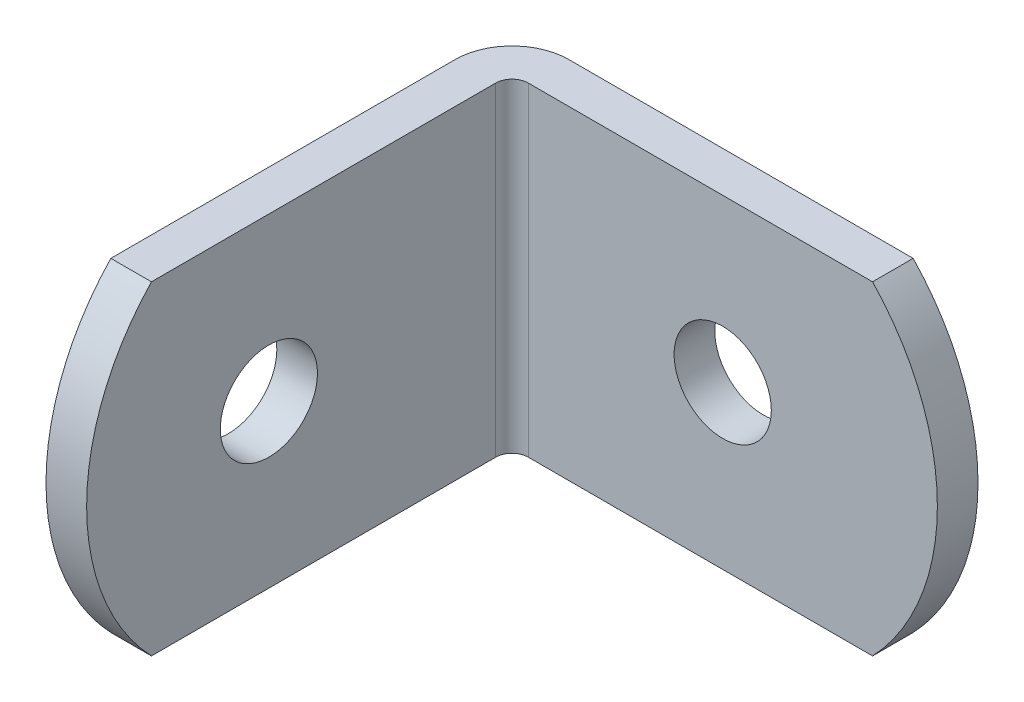
ISO-10303-21;
HEADER;
FILE_DESCRIPTION(('STEP AP214'),'2;1');
FILE_NAME('part.step','',(''),(''),'','','');
FILE_SCHEMA(('AUTOMOTIVE_DESIGN { 1 0 10303 214 1 1 1 1 }'));
ENDSEC;
DATA;
#1=APPLICATION_CONTEXT('core data for automotive mechanical design processes');
#2=APPLICATION_PROTOCOL_DEFINITION('international standard','automotive_design',2000,#1);
#3=PRODUCT_CONTEXT('',#1,'mechanical');
#4=PRODUCT('Part','Part','',(#3));
#5=PRODUCT_RELATED_PRODUCT_CATEGORY('part','',(#4));
#6=PRODUCT_DEFINITION_FORMATION('','',#4);
#7=PRODUCT_DEFINITION_CONTEXT('part definition',#1,'design');
#8=PRODUCT_DEFINITION('design','',#6,#7);
#9=PRODUCT_DEFINITION_SHAPE('','',#8);
#10=(LENGTH_UNIT() NAMED_UNIT(*) SI_UNIT(.MILLI.,.METRE.));
#11=(NAMED_UNIT(*) PLANE_ANGLE_UNIT() SI_UNIT($,.RADIAN.));
#12=(NAMED_UNIT(*) SI_UNIT($,.STERADIAN.) SOLID_ANGLE_UNIT());
#13=UNCERTAINTY_MEASURE_WITH_UNIT(LENGTH_MEASURE(1.E-05),#10,'distance_accuracy_value','');
#14=(GEOMETRIC_REPRESENTATION_CONTEXT(3) GLOBAL_UNCERTAINTY_ASSIGNED_CONTEXT((#13)) GLOBAL_UNIT_ASSIGNED_CONTEXT((#10,
#11,#12)) REPRESENTATION_CONTEXT('',''));
#15=CARTESIAN_POINT('',(0.,0.,0.));
#16=DIRECTION('',(0.,0.,1.));
#17=DIRECTION('',(1.,0.,0.));
#18=AXIS2_PLACEMENT_3D('',#15,#16,#17);
#19=CARTESIAN_POINT('',(73.5960459180228,0.,11.41095));
#20=DIRECTION('',(-1.,0.,0.));
#21=DIRECTION('',(0.,0.,1.));
#22=AXIS2_PLACEMENT_3D('',#19,#20,#21);
#23=CYLINDRICAL_SURFACE('',#22,11.60145);
#24=DIRECTION('',(-1.,0.,0.));
#25=VECTOR('',#24,1.);
#26=CARTESIAN_POINT('',(73.5960459180228,-8.001,19.812));
#27=LINE('',#26,#25);
#28=CARTESIAN_POINT('',(0.,-8.001,19.812));
#29=VERTEX_POINT('',#28);
#30=CARTESIAN_POINT('',(2.0066,-8.001,19.812));
#31=VERTEX_POINT('',#30);
#32=EDGE_CURVE('E42',#29,#31,#27,.F.);
#33=ORIENTED_EDGE('',*,*,#32,.T.);
#34=CARTESIAN_POINT('',(2.0066,0.,11.41095));
#35=DIRECTION('',(-1.,0.,0.));
#36=DIRECTION('',(0.,0.,1.));
#37=AXIS2_PLACEMENT_3D('',#34,#35,#36);
#38=CIRCLE('',#37,11.60145);
#39=CARTESIAN_POINT('',(2.0066,8.001,19.812));
#40=VERTEX_POINT('',#39);
#41=EDGE_CURVE('E129',#40,#31,#38,.F.);
#42=ORIENTED_EDGE('',*,*,#41,.F.);
#43=DIRECTION('',(-1.,0.,0.));
#44=VECTOR('',#43,1.);
#45=CARTESIAN_POINT('',(73.5960459180228,8.001,19.812));
#46=LINE('',#45,#44);
#47=CARTESIAN_POINT('',(0.,8.001,19.812));
#48=VERTEX_POINT('',#47);
#49=EDGE_CURVE('E125',#40,#48,#46,.T.);
#50=ORIENTED_EDGE('',*,*,#49,.T.);
#51=CARTESIAN_POINT('',(0.,0.,11.41095));
#52=DIRECTION('',(-1.,0.,0.));
#53=DIRECTION('',(0.,0.,1.));
#54=AXIS2_PLACEMENT_3D('',#51,#52,#53);
#55=CIRCLE('',#54,11.60145);
#56=EDGE_CURVE('E131',#48,#29,#55,.F.);
#57=ORIENTED_EDGE('',*,*,#56,.T.);
#58=EDGE_LOOP('',(#33,#42,#50,#57));
#59=FACE_BOUND('',#58,.T.);
#60=ADVANCED_FACE('F34',(#59),#23,.T.);
#61=CARTESIAN_POINT('',(2.80924,8.001,2.0066));
#62=DIRECTION('',(0.,0.,-1.));
#63=DIRECTION('',(-1.,0.,0.));
#64=AXIS2_PLACEMENT_3D('',#61,#62,#63);
#65=PLANE('',#64);
#66=CARTESIAN_POINT('',(12.4124,0.,2.0066));
#67=DIRECTION('',(0.,0.,1.));
#68=DIRECTION('',(1.,0.,0.));
#69=AXIS2_PLACEMENT_3D('',#66,#67,#68);
#70=CIRCLE('',#69,2.4);
#71=CARTESIAN_POINT('',(14.8124,0.,2.0066));
#72=VERTEX_POINT('',#71);
#73=EDGE_CURVE('E181',#72,#72,#70,.T.);
#74=ORIENTED_EDGE('',*,*,#73,.F.);
#75=EDGE_LOOP('',(#74));
#76=FACE_BOUND('',#75,.T.);
#77=DIRECTION('',(1.,0.,0.));
#78=VECTOR('',#77,1.);
#79=CARTESIAN_POINT('',(2.80924,-8.001,2.0066));
#80=LINE('',#79,#78);
#81=CARTESIAN_POINT('',(2.80924,-8.001,2.0066));
#82=VERTEX_POINT('',#81);
#83=CARTESIAN_POINT('',(19.812,-8.001,2.0066));
#84=VERTEX_POINT('',#83);
#85=EDGE_CURVE('E108',#82,#84,#80,.T.);
#86=ORIENTED_EDGE('',*,*,#85,.T.);
#87=CARTESIAN_POINT('',(11.41095,0.,2.0066));
#88=DIRECTION('',(0.,0.,-1.));
#89=DIRECTION('',(-1.,0.,0.));
#90=AXIS2_PLACEMENT_3D('',#87,#88,#89);
#91=CIRCLE('',#90,11.60145);
#92=CARTESIAN_POINT('',(19.812,8.001,2.0066));
#93=VERTEX_POINT('',#92);
#94=EDGE_CURVE('E56',#84,#93,#91,.F.);
#95=ORIENTED_EDGE('',*,*,#94,.T.);
#96=DIRECTION('',(1.,0.,0.));
#97=VECTOR('',#96,1.);
#98=CARTESIAN_POINT('',(2.80924,8.001,2.0066));
#99=LINE('',#98,#97);
#100=CARTESIAN_POINT('',(2.80924,8.001,2.0066));
#101=VERTEX_POINT('',#100);
#102=EDGE_CURVE('E134',#101,#93,#99,.T.);
#103=ORIENTED_EDGE('',*,*,#102,.F.);
#104=DIRECTION('',(0.,-1.,0.));
#105=VECTOR('',#104,1.);
#106=CARTESIAN_POINT('',(2.80924,8.001,2.0066));
#107=LINE('',#106,#105);
#108=EDGE_CURVE('E147',#101,#82,#107,.T.);
#109=ORIENTED_EDGE('',*,*,#108,.T.);
#110=EDGE_LOOP('',(#86,#95,#103,#109));
#111=FACE_BOUND('',#110,.T.);
#112=ADVANCED_FACE('F36',(#76,#111),#65,.F.);
#113=CARTESIAN_POINT('',(2.80924,8.001,0.));
#114=DIRECTION('',(0.,0.,-1.));
#115=DIRECTION('',(-1.,0.,0.));
#116=AXIS2_PLACEMENT_3D('',#113,#114,#115);
#117=PLANE('',#116);
#118=CARTESIAN_POINT('',(12.4124,0.,0.));
#119=DIRECTION('',(0.,0.,1.));
#120=DIRECTION('',(1.,0.,0.));
#121=AXIS2_PLACEMENT_3D('',#118,#119,#120);
#122=CIRCLE('',#121,2.4);
#123=CARTESIAN_POINT('',(14.8124,0.,0.));
#124=VERTEX_POINT('',#123);
#125=EDGE_CURVE('E179',#124,#124,#122,.T.);
#126=ORIENTED_EDGE('',*,*,#125,.T.);
#127=EDGE_LOOP('',(#126));
#128=FACE_BOUND('',#127,.T.);
#129=CARTESIAN_POINT('',(11.41095,0.,0.));
#130=DIRECTION('',(0.,0.,-1.));
#131=DIRECTION('',(-1.,0.,0.));
#132=AXIS2_PLACEMENT_3D('',#129,#130,#131);
#133=CIRCLE('',#132,11.60145);
#134=CARTESIAN_POINT('',(19.812,-8.001,0.));
#135=VERTEX_POINT('',#134);
#136=CARTESIAN_POINT('',(19.812,8.001,0.));
#137=VERTEX_POINT('',#136);
#138=EDGE_CURVE('E48',#135,#137,#133,.F.);
#139=ORIENTED_EDGE('',*,*,#138,.F.);
#140=DIRECTION('',(1.,0.,0.));
#141=VECTOR('',#140,1.);
#142=CARTESIAN_POINT('',(2.80924,-8.001,0.));
#143=LINE('',#142,#141);
#144=CARTESIAN_POINT('',(2.80924,-8.001,0.));
#145=VERTEX_POINT('',#144);
#146=EDGE_CURVE('E102',#145,#135,#143,.T.);
#147=ORIENTED_EDGE('',*,*,#146,.F.);
#148=DIRECTION('',(0.,-1.,0.));
#149=VECTOR('',#148,1.);
#150=CARTESIAN_POINT('',(2.80924,8.001,0.));
#151=LINE('',#150,#149);
#152=CARTESIAN_POINT('',(2.80924,8.001,0.));
#153=VERTEX_POINT('',#152);
#154=EDGE_CURVE('E163',#153,#145,#151,.T.);
#155=ORIENTED_EDGE('',*,*,#154,.F.);
#156=DIRECTION('',(1.,0.,0.));
#157=VECTOR('',#156,1.);
#158=CARTESIAN_POINT('',(2.80924,8.001,0.));
#159=LINE('',#158,#157);
#160=EDGE_CURVE('E113',#153,#137,#159,.T.);
#161=ORIENTED_EDGE('',*,*,#160,.T.);
#162=EDGE_LOOP('',(#139,#147,#155,#161));
#163=FACE_BOUND('',#162,.T.);
#164=ADVANCED_FACE('F111',(#128,#163),#117,.T.);
#165=CARTESIAN_POINT('',(2.80924,8.001,2.80924));
#166=DIRECTION('',(0.,-1.,0.));
#167=DIRECTION('',(0.,0.,-1.));
#168=AXIS2_PLACEMENT_3D('',#165,#166,#167);
#169=CYLINDRICAL_SURFACE('',#168,2.80924);
#170=CARTESIAN_POINT('',(2.80924,-8.001,2.80924));
#171=DIRECTION('',(0.,-1.,0.));
#172=DIRECTION('',(0.,0.,1.));
#173=AXIS2_PLACEMENT_3D('',#170,#171,#172);
#174=CIRCLE('',#173,2.80924);
#175=CARTESIAN_POINT('',(0.,-8.001,2.80924));
#176=VERTEX_POINT('',#175);
#177=EDGE_CURVE('E106',#176,#145,#174,.T.);
#178=ORIENTED_EDGE('',*,*,#177,.F.);
#179=DIRECTION('',(0.,-1.,0.));
#180=VECTOR('',#179,1.);
#181=CARTESIAN_POINT('',(0.,8.001,2.80924));
#182=LINE('',#181,#180);
#183=CARTESIAN_POINT('',(0.,8.001,2.80924));
#184=VERTEX_POINT('',#183);
#185=EDGE_CURVE('E160',#184,#176,#182,.T.);
#186=ORIENTED_EDGE('',*,*,#185,.F.);
#187=CARTESIAN_POINT('',(2.80924,8.001,2.80924));
#188=DIRECTION('',(0.,-1.,0.));
#189=DIRECTION('',(0.,0.,1.));
#190=AXIS2_PLACEMENT_3D('',#187,#188,#189);
#191=CIRCLE('',#190,2.80924);
#192=EDGE_CURVE('E138',#184,#153,#191,.T.);
#193=ORIENTED_EDGE('',*,*,#192,.T.);
#194=ORIENTED_EDGE('',*,*,#154,.T.);
#195=EDGE_LOOP('',(#178,#186,#193,#194));
#196=FACE_BOUND('',#195,.T.);
#197=ADVANCED_FACE('F176',(#196),#169,.T.);
#198=CARTESIAN_POINT('',(0.,8.001,2.80924));
#199=DIRECTION('',(-1.,0.,0.));
#200=DIRECTION('',(0.,0.,1.));
#201=AXIS2_PLACEMENT_3D('',#198,#199,#200);
#202=PLANE('',#201);
#203=CARTESIAN_POINT('',(0.,0.,14.0124));
#204=DIRECTION('',(1.,0.,0.));
#205=DIRECTION('',(0.,0.,-1.));
#206=AXIS2_PLACEMENT_3D('',#203,#204,#205);
#207=CIRCLE('',#206,2.4);
#208=CARTESIAN_POINT('',(0.,0.,11.6124));
#209=VERTEX_POINT('',#208);
#210=EDGE_CURVE('E120',#209,#209,#207,.T.);
#211=ORIENTED_EDGE('',*,*,#210,.T.);
#212=EDGE_LOOP('',(#211));
#213=FACE_BOUND('',#212,.T.);
#214=ORIENTED_EDGE('',*,*,#56,.F.);
#215=DIRECTION('',(0.,0.,-1.));
#216=VECTOR('',#215,1.);
#217=CARTESIAN_POINT('',(0.,8.001,2.80924));
#218=LINE('',#217,#216);
#219=EDGE_CURVE('E141',#48,#184,#218,.T.);
#220=ORIENTED_EDGE('',*,*,#219,.T.);
#221=ORIENTED_EDGE('',*,*,#185,.T.);
#222=DIRECTION('',(0.,0.,-1.));
#223=VECTOR('',#222,1.);
#224=CARTESIAN_POINT('',(0.,-8.001,2.80924));
#225=LINE('',#224,#223);
#226=EDGE_CURVE('E150',#29,#176,#225,.T.);
#227=ORIENTED_EDGE('',*,*,#226,.F.);
#228=EDGE_LOOP('',(#214,#220,#221,#227));
#229=FACE_BOUND('',#228,.T.);
#230=ADVANCED_FACE('F171',(#213,#229),#202,.T.);
#231=CARTESIAN_POINT('',(2.0066,8.001,2.80924));
#232=DIRECTION('',(-1.,0.,0.));
#233=DIRECTION('',(0.,0.,1.));
#234=AXIS2_PLACEMENT_3D('',#231,#232,#233);
#235=PLANE('',#234);
#236=CARTESIAN_POINT('',(2.0066,0.,14.0124));
#237=DIRECTION('',(1.,0.,0.));
#238=DIRECTION('',(0.,0.,-1.));
#239=AXIS2_PLACEMENT_3D('',#236,#237,#238);
#240=CIRCLE('',#239,2.4);
#241=CARTESIAN_POINT('',(2.0066,0.,11.6124));
#242=VERTEX_POINT('',#241);
#243=EDGE_CURVE('E117',#242,#242,#240,.T.);
#244=ORIENTED_EDGE('',*,*,#243,.F.);
#245=EDGE_LOOP('',(#244));
#246=FACE_BOUND('',#245,.T.);
#247=ORIENTED_EDGE('',*,*,#41,.T.);
#248=DIRECTION('',(0.,0.,-1.));
#249=VECTOR('',#248,1.);
#250=CARTESIAN_POINT('',(2.0066,-8.001,2.80924));
#251=LINE('',#250,#249);
#252=CARTESIAN_POINT('',(2.0066,-8.001,2.80924));
#253=VERTEX_POINT('',#252);
#254=EDGE_CURVE('E152',#31,#253,#251,.T.);
#255=ORIENTED_EDGE('',*,*,#254,.T.);
#256=DIRECTION('',(0.,-1.,0.));
#257=VECTOR('',#256,1.);
#258=CARTESIAN_POINT('',(2.0066,8.001,2.80924));
#259=LINE('',#258,#257);
#260=CARTESIAN_POINT('',(2.0066,8.001,2.80924));
#261=VERTEX_POINT('',#260);
#262=EDGE_CURVE('E157',#261,#253,#259,.T.);
#263=ORIENTED_EDGE('',*,*,#262,.F.);
#264=DIRECTION('',(0.,0.,-1.));
#265=VECTOR('',#264,1.);
#266=CARTESIAN_POINT('',(2.0066,8.001,2.80924));
#267=LINE('',#266,#265);
#268=EDGE_CURVE('E143',#40,#261,#267,.T.);
#269=ORIENTED_EDGE('',*,*,#268,.F.);
#270=EDGE_LOOP('',(#247,#255,#263,#269));
#271=FACE_BOUND('',#270,.T.);
#272=ADVANCED_FACE('F197',(#246,#271),#235,.F.);
#273=CARTESIAN_POINT('',(2.80924,8.001,2.80924));
#274=DIRECTION('',(0.,-1.,0.));
#275=DIRECTION('',(0.,0.,-1.));
#276=AXIS2_PLACEMENT_3D('',#273,#274,#275);
#277=CYLINDRICAL_SURFACE('',#276,0.80264);
#278=CARTESIAN_POINT('',(2.80924,-8.001,2.80924));
#279=DIRECTION('',(0.,1.,0.));
#280=DIRECTION('',(1.,0.,0.));
#281=AXIS2_PLACEMENT_3D('',#278,#279,#280);
#282=CIRCLE('',#281,0.80264);
#283=EDGE_CURVE('E136',#253,#82,#282,.F.);
#284=ORIENTED_EDGE('',*,*,#283,.T.);
#285=ORIENTED_EDGE('',*,*,#108,.F.);
#286=CARTESIAN_POINT('',(2.80924,8.001,2.80924));
#287=DIRECTION('',(0.,1.,0.));
#288=DIRECTION('',(1.,0.,0.));
#289=AXIS2_PLACEMENT_3D('',#286,#287,#288);
#290=CIRCLE('',#289,0.80264);
#291=EDGE_CURVE('E145',#261,#101,#290,.F.);
#292=ORIENTED_EDGE('',*,*,#291,.F.);
#293=ORIENTED_EDGE('',*,*,#262,.T.);
#294=EDGE_LOOP('',(#284,#285,#292,#293));
#295=FACE_BOUND('',#294,.T.);
#296=ADVANCED_FACE('F192',(#295),#277,.F.);
#297=CARTESIAN_POINT('',(2.80924,8.001,2.80924));
#298=DIRECTION('',(0.,-1.,0.));
#299=DIRECTION('',(-1.,0.,0.));
#300=AXIS2_PLACEMENT_3D('',#297,#298,#299);
#301=PLANE('',#300);
#302=ORIENTED_EDGE('',*,*,#102,.T.);
#303=DIRECTION('',(0.,0.,-1.));
#304=VECTOR('',#303,1.);
#305=CARTESIAN_POINT('',(19.812,8.001,69.5955459180228));
#306=LINE('',#305,#304);
#307=EDGE_CURVE('E114',#93,#137,#306,.T.);
#308=ORIENTED_EDGE('',*,*,#307,.T.);
#309=ORIENTED_EDGE('',*,*,#160,.F.);
#310=ORIENTED_EDGE('',*,*,#192,.F.);
#311=ORIENTED_EDGE('',*,*,#219,.F.);
#312=ORIENTED_EDGE('',*,*,#49,.F.);
#313=ORIENTED_EDGE('',*,*,#268,.T.);
#314=ORIENTED_EDGE('',*,*,#291,.T.);
#315=EDGE_LOOP('',(#302,#308,#309,#310,#311,#312,#313,#314));
#316=FACE_BOUND('',#315,.T.);
#317=ADVANCED_FACE('F178',(#316),#301,.F.);
#318=CARTESIAN_POINT('',(2.80924,-8.001,2.80924));
#319=DIRECTION('',(0.,-1.,0.));
#320=DIRECTION('',(-1.,0.,0.));
#321=AXIS2_PLACEMENT_3D('',#318,#319,#320);
#322=PLANE('',#321);
#323=DIRECTION('',(0.,0.,-1.));
#324=VECTOR('',#323,1.);
#325=CARTESIAN_POINT('',(19.812,-8.001,69.5955459180228));
#326=LINE('',#325,#324);
#327=EDGE_CURVE('E11',#84,#135,#326,.T.);
#328=ORIENTED_EDGE('',*,*,#327,.F.);
#329=ORIENTED_EDGE('',*,*,#85,.F.);
#330=ORIENTED_EDGE('',*,*,#283,.F.);
#331=ORIENTED_EDGE('',*,*,#254,.F.);
#332=ORIENTED_EDGE('',*,*,#32,.F.);
#333=ORIENTED_EDGE('',*,*,#226,.T.);
#334=ORIENTED_EDGE('',*,*,#177,.T.);
#335=ORIENTED_EDGE('',*,*,#146,.T.);
#336=EDGE_LOOP('',(#328,#329,#330,#331,#332,#333,#334,#335));
#337=FACE_BOUND('',#336,.T.);
#338=ADVANCED_FACE('F103',(#337),#322,.T.);
#339=CARTESIAN_POINT('',(0.,0.,14.0124));
#340=DIRECTION('',(1.,0.,0.));
#341=DIRECTION('',(0.,0.,-1.));
#342=AXIS2_PLACEMENT_3D('',#339,#340,#341);
#343=CYLINDRICAL_SURFACE('',#342,2.4);
#344=ORIENTED_EDGE('',*,*,#210,.F.);
#345=EDGE_LOOP('',(#344));
#346=FACE_BOUND('',#345,.T.);
#347=ORIENTED_EDGE('',*,*,#243,.T.);
#348=EDGE_LOOP('',(#347));
#349=FACE_BOUND('',#348,.T.);
#350=ADVANCED_FACE('F215',(#346,#349),#343,.F.);
#351=CARTESIAN_POINT('',(11.41095,0.,69.5955459180228));
#352=DIRECTION('',(0.,0.,-1.));
#353=DIRECTION('',(-1.,0.,0.));
#354=AXIS2_PLACEMENT_3D('',#351,#352,#353);
#355=CYLINDRICAL_SURFACE('',#354,11.60145);
#356=ORIENTED_EDGE('',*,*,#94,.F.);
#357=ORIENTED_EDGE('',*,*,#327,.T.);
#358=ORIENTED_EDGE('',*,*,#138,.T.);
#359=ORIENTED_EDGE('',*,*,#307,.F.);
#360=EDGE_LOOP('',(#356,#357,#358,#359));
#361=FACE_BOUND('',#360,.T.);
#362=ADVANCED_FACE('F116',(#361),#355,.T.);
#363=CARTESIAN_POINT('',(12.4124,0.,0.));
#364=DIRECTION('',(0.,0.,1.));
#365=DIRECTION('',(1.,0.,0.));
#366=AXIS2_PLACEMENT_3D('',#363,#364,#365);
#367=CYLINDRICAL_SURFACE('',#366,2.4);
#368=ORIENTED_EDGE('',*,*,#125,.F.);
#369=EDGE_LOOP('',(#368));
#370=FACE_BOUND('',#369,.T.);
#371=ORIENTED_EDGE('',*,*,#73,.T.);
#372=EDGE_LOOP('',(#371));
#373=FACE_BOUND('',#372,.T.);
#374=ADVANCED_FACE('F187',(#370,#373),#367,.F.);
#375=CLOSED_SHELL('',(#60,#112,#164,#197,#230,#272,#296,#317,#338,#350,#362,#374));
#376=MANIFOLD_SOLID_BREP('B2',#375);
#377=ADVANCED_BREP_SHAPE_REPRESENTATION('',(#18,#376),#14);
#378=SHAPE_DEFINITION_REPRESENTATION(#9,#377);
ENDSEC;
END-ISO-10303-21;
